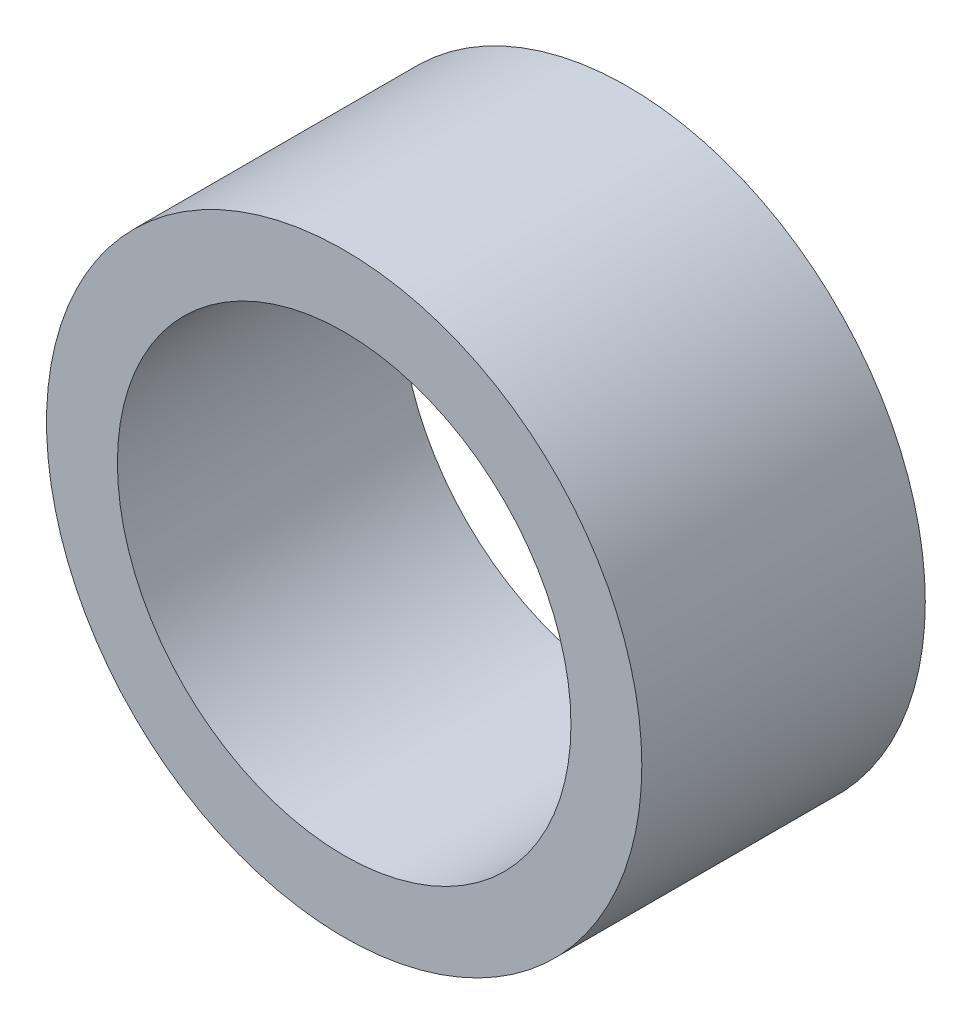
ISO-10303-21;
HEADER;
FILE_DESCRIPTION(('STEP AP214'),'2;1');
FILE_NAME('part.step','',(''),(''),'','','');
FILE_SCHEMA(('AUTOMOTIVE_DESIGN { 1 0 10303 214 1 1 1 1 }'));
ENDSEC;
DATA;
#1=APPLICATION_CONTEXT('core data for automotive mechanical design processes');
#2=APPLICATION_PROTOCOL_DEFINITION('international standard','automotive_design',2000,#1);
#3=PRODUCT_CONTEXT('',#1,'mechanical');
#4=PRODUCT('Part','Part','',(#3));
#5=PRODUCT_RELATED_PRODUCT_CATEGORY('part','',(#4));
#6=PRODUCT_DEFINITION_FORMATION('','',#4);
#7=PRODUCT_DEFINITION_CONTEXT('part definition',#1,'design');
#8=PRODUCT_DEFINITION('design','',#6,#7);
#9=PRODUCT_DEFINITION_SHAPE('','',#8);
#10=(LENGTH_UNIT() NAMED_UNIT(*) SI_UNIT(.MILLI.,.METRE.));
#11=(NAMED_UNIT(*) PLANE_ANGLE_UNIT() SI_UNIT($,.RADIAN.));
#12=(NAMED_UNIT(*) SI_UNIT($,.STERADIAN.) SOLID_ANGLE_UNIT());
#13=UNCERTAINTY_MEASURE_WITH_UNIT(LENGTH_MEASURE(1.E-05),#10,'distance_accuracy_value','');
#14=(GEOMETRIC_REPRESENTATION_CONTEXT(3) GLOBAL_UNCERTAINTY_ASSIGNED_CONTEXT((#13)) GLOBAL_UNIT_ASSIGNED_CONTEXT((#10,
#11,#12)) REPRESENTATION_CONTEXT('',''));
#15=CARTESIAN_POINT('',(0.,0.,0.));
#16=DIRECTION('',(0.,0.,1.));
#17=DIRECTION('',(1.,0.,0.));
#18=AXIS2_PLACEMENT_3D('',#15,#16,#17);
#19=CARTESIAN_POINT('',(0.,0.,5.));
#20=DIRECTION('',(0.,0.,-1.));
#21=DIRECTION('',(-1.,0.,0.));
#22=AXIS2_PLACEMENT_3D('',#19,#20,#21);
#23=CYLINDRICAL_SURFACE('',#22,4.);
#24=CARTESIAN_POINT('',(0.,0.,5.));
#25=DIRECTION('',(0.,0.,1.));
#26=DIRECTION('',(1.,0.,0.));
#27=AXIS2_PLACEMENT_3D('',#24,#25,#26);
#28=CIRCLE('',#27,4.);
#29=CARTESIAN_POINT('',(4.,0.,5.));
#30=VERTEX_POINT('',#29);
#31=EDGE_CURVE('E40',#30,#30,#28,.T.);
#32=ORIENTED_EDGE('',*,*,#31,.T.);
#33=EDGE_LOOP('',(#32));
#34=FACE_BOUND('',#33,.T.);
#35=CARTESIAN_POINT('',(0.,0.,0.));
#36=DIRECTION('',(0.,0.,1.));
#37=DIRECTION('',(1.,0.,0.));
#38=AXIS2_PLACEMENT_3D('',#35,#36,#37);
#39=CIRCLE('',#38,4.);
#40=CARTESIAN_POINT('',(4.,0.,0.));
#41=VERTEX_POINT('',#40);
#42=EDGE_CURVE('E46',#41,#41,#39,.T.);
#43=ORIENTED_EDGE('',*,*,#42,.F.);
#44=EDGE_LOOP('',(#43));
#45=FACE_BOUND('',#44,.T.);
#46=ADVANCED_FACE('F33',(#34,#45),#23,.F.);
#47=CARTESIAN_POINT('',(0.,0.,5.));
#48=DIRECTION('',(0.,0.,-1.));
#49=DIRECTION('',(-1.,0.,0.));
#50=AXIS2_PLACEMENT_3D('',#47,#48,#49);
#51=CYLINDRICAL_SURFACE('',#50,5.25);
#52=CARTESIAN_POINT('',(0.,0.,5.));
#53=DIRECTION('',(0.,0.,1.));
#54=DIRECTION('',(1.,0.,0.));
#55=AXIS2_PLACEMENT_3D('',#52,#53,#54);
#56=CIRCLE('',#55,5.25);
#57=CARTESIAN_POINT('',(5.25,0.,5.));
#58=VERTEX_POINT('',#57);
#59=EDGE_CURVE('E10',#58,#58,#56,.T.);
#60=ORIENTED_EDGE('',*,*,#59,.F.);
#61=EDGE_LOOP('',(#60));
#62=FACE_BOUND('',#61,.T.);
#63=CARTESIAN_POINT('',(0.,0.,0.));
#64=DIRECTION('',(0.,0.,1.));
#65=DIRECTION('',(1.,0.,0.));
#66=AXIS2_PLACEMENT_3D('',#63,#64,#65);
#67=CIRCLE('',#66,5.25);
#68=CARTESIAN_POINT('',(5.25,0.,0.));
#69=VERTEX_POINT('',#68);
#70=EDGE_CURVE('E36',#69,#69,#67,.T.);
#71=ORIENTED_EDGE('',*,*,#70,.T.);
#72=EDGE_LOOP('',(#71));
#73=FACE_BOUND('',#72,.T.);
#74=ADVANCED_FACE('F53',(#62,#73),#51,.T.);
#75=CARTESIAN_POINT('',(0.,0.,5.));
#76=DIRECTION('',(0.,0.,1.));
#77=DIRECTION('',(1.,0.,0.));
#78=AXIS2_PLACEMENT_3D('',#75,#76,#77);
#79=PLANE('',#78);
#80=ORIENTED_EDGE('',*,*,#31,.F.);
#81=EDGE_LOOP('',(#80));
#82=FACE_BOUND('',#81,.T.);
#83=ORIENTED_EDGE('',*,*,#59,.T.);
#84=EDGE_LOOP('',(#83));
#85=FACE_BOUND('',#84,.T.);
#86=ADVANCED_FACE('F57',(#82,#85),#79,.T.);
#87=CARTESIAN_POINT('',(0.,0.,0.));
#88=DIRECTION('',(0.,0.,1.));
#89=DIRECTION('',(1.,0.,0.));
#90=AXIS2_PLACEMENT_3D('',#87,#88,#89);
#91=PLANE('',#90);
#92=ORIENTED_EDGE('',*,*,#42,.T.);
#93=EDGE_LOOP('',(#92));
#94=FACE_BOUND('',#93,.T.);
#95=ORIENTED_EDGE('',*,*,#70,.F.);
#96=EDGE_LOOP('',(#95));
#97=FACE_BOUND('',#96,.T.);
#98=ADVANCED_FACE('F55',(#94,#97),#91,.F.);
#99=CLOSED_SHELL('',(#46,#74,#86,#98));
#100=MANIFOLD_SOLID_BREP('B2',#99);
#101=ADVANCED_BREP_SHAPE_REPRESENTATION('',(#18,#100),#14);
#102=SHAPE_DEFINITION_REPRESENTATION(#9,#101);
ENDSEC;
END-ISO-10303-21;
